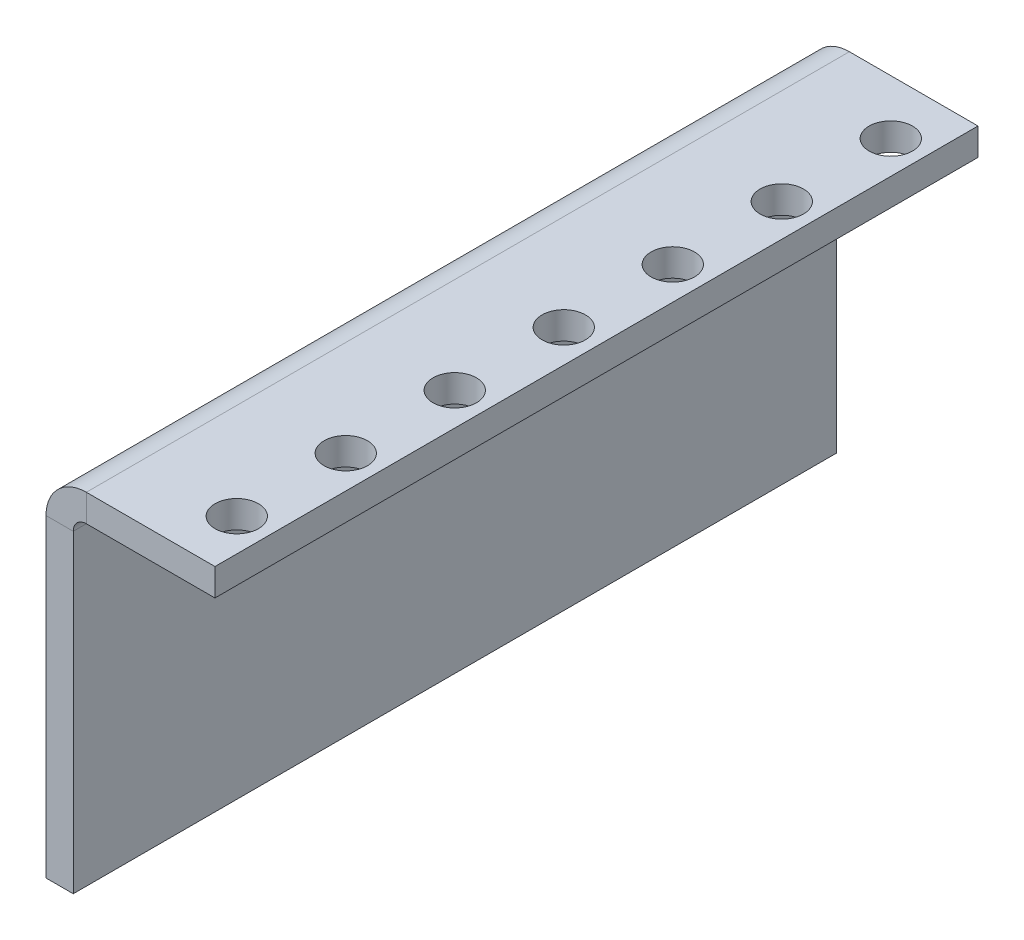
ISO-10303-21;
HEADER;
FILE_DESCRIPTION(('STEP AP214'),'2;1');
FILE_NAME('part.step','',(''),(''),'','','');
FILE_SCHEMA(('AUTOMOTIVE_DESIGN { 1 0 10303 214 1 1 1 1 }'));
ENDSEC;
DATA;
#1=APPLICATION_CONTEXT('core data for automotive mechanical design processes');
#2=APPLICATION_PROTOCOL_DEFINITION('international standard','automotive_design',2000,#1);
#3=PRODUCT_CONTEXT('',#1,'mechanical');
#4=PRODUCT('Part','Part','',(#3));
#5=PRODUCT_RELATED_PRODUCT_CATEGORY('part','',(#4));
#6=PRODUCT_DEFINITION_FORMATION('','',#4);
#7=PRODUCT_DEFINITION_CONTEXT('part definition',#1,'design');
#8=PRODUCT_DEFINITION('design','',#6,#7);
#9=PRODUCT_DEFINITION_SHAPE('','',#8);
#10=(LENGTH_UNIT() NAMED_UNIT(*) SI_UNIT(.MILLI.,.METRE.));
#11=(NAMED_UNIT(*) PLANE_ANGLE_UNIT() SI_UNIT($,.RADIAN.));
#12=(NAMED_UNIT(*) SI_UNIT($,.STERADIAN.) SOLID_ANGLE_UNIT());
#13=UNCERTAINTY_MEASURE_WITH_UNIT(LENGTH_MEASURE(1.E-05),#10,'distance_accuracy_value','');
#14=(GEOMETRIC_REPRESENTATION_CONTEXT(3) GLOBAL_UNCERTAINTY_ASSIGNED_CONTEXT((#13)) GLOBAL_UNIT_ASSIGNED_CONTEXT((#10,
#11,#12)) REPRESENTATION_CONTEXT('',''));
#15=CARTESIAN_POINT('',(0.,0.,0.));
#16=DIRECTION('',(0.,0.,1.));
#17=DIRECTION('',(1.,0.,0.));
#18=AXIS2_PLACEMENT_3D('',#15,#16,#17);
#19=CARTESIAN_POINT('',(0.,36.576,88.9));
#20=DIRECTION('',(0.,0.,1.));
#21=DIRECTION('',(1.,0.,0.));
#22=AXIS2_PLACEMENT_3D('',#19,#20,#21);
#23=PLANE('',#22);
#24=DIRECTION('',(-1.,0.,0.));
#25=VECTOR('',#24,1.);
#26=CARTESIAN_POINT('',(0.,36.576,88.9));
#27=LINE('',#26,#25);
#28=CARTESIAN_POINT('',(0.,36.576,88.9));
#29=VERTEX_POINT('',#28);
#30=CARTESIAN_POINT('',(-3.175,36.5759999999999,88.9));
#31=VERTEX_POINT('',#30);
#32=EDGE_CURVE('E11',#29,#31,#27,.T.);
#33=ORIENTED_EDGE('',*,*,#32,.F.);
#34=CARTESIAN_POINT('',(1.524,36.576,88.9));
#35=DIRECTION('',(0.,0.,1.));
#36=DIRECTION('',(1.,0.,0.));
#37=AXIS2_PLACEMENT_3D('',#34,#35,#36);
#38=CIRCLE('',#37,1.524);
#39=CARTESIAN_POINT('',(1.524,38.1,88.9));
#40=VERTEX_POINT('',#39);
#41=EDGE_CURVE('E132',#29,#40,#38,.F.);
#42=ORIENTED_EDGE('',*,*,#41,.T.);
#43=DIRECTION('',(0.,-1.,0.));
#44=VECTOR('',#43,1.);
#45=CARTESIAN_POINT('',(1.524,41.275,88.9));
#46=LINE('',#45,#44);
#47=CARTESIAN_POINT('',(1.524,41.275,88.9));
#48=VERTEX_POINT('',#47);
#49=EDGE_CURVE('E50',#48,#40,#46,.T.);
#50=ORIENTED_EDGE('',*,*,#49,.F.);
#51=CARTESIAN_POINT('',(1.524,36.576,88.9));
#52=DIRECTION('',(0.,0.,1.));
#53=DIRECTION('',(1.,0.,0.));
#54=AXIS2_PLACEMENT_3D('',#51,#52,#53);
#55=CIRCLE('',#54,4.699);
#56=EDGE_CURVE('E139',#31,#48,#55,.F.);
#57=ORIENTED_EDGE('',*,*,#56,.F.);
#58=EDGE_LOOP('',(#33,#42,#50,#57));
#59=FACE_BOUND('',#58,.T.);
#60=ADVANCED_FACE('F42',(#59),#23,.T.);
#61=CARTESIAN_POINT('',(1.524,41.275,88.9));
#62=DIRECTION('',(0.,0.,1.));
#63=DIRECTION('',(1.,0.,0.));
#64=AXIS2_PLACEMENT_3D('',#61,#62,#63);
#65=PLANE('',#64);
#66=DIRECTION('',(0.,1.,0.));
#67=VECTOR('',#66,1.);
#68=CARTESIAN_POINT('',(0.,0.,88.9));
#69=LINE('',#68,#67);
#70=CARTESIAN_POINT('',(0.,0.,88.9));
#71=VERTEX_POINT('',#70);
#72=EDGE_CURVE('E127',#71,#29,#69,.T.);
#73=ORIENTED_EDGE('',*,*,#72,.T.);
#74=ORIENTED_EDGE('',*,*,#32,.T.);
#75=DIRECTION('',(0.,1.,0.));
#76=VECTOR('',#75,1.);
#77=CARTESIAN_POINT('',(-3.175,0.,88.9));
#78=LINE('',#77,#76);
#79=CARTESIAN_POINT('',(-3.175,0.,88.9));
#80=VERTEX_POINT('',#79);
#81=EDGE_CURVE('E137',#80,#31,#78,.T.);
#82=ORIENTED_EDGE('',*,*,#81,.F.);
#83=DIRECTION('',(-1.,0.,0.));
#84=VECTOR('',#83,1.);
#85=CARTESIAN_POINT('',(0.,0.,88.9));
#86=LINE('',#85,#84);
#87=EDGE_CURVE('E118',#71,#80,#86,.T.);
#88=ORIENTED_EDGE('',*,*,#87,.F.);
#89=EDGE_LOOP('',(#73,#74,#82,#88));
#90=FACE_BOUND('',#89,.T.);
#91=ADVANCED_FACE('F135',(#90),#65,.T.);
#92=CARTESIAN_POINT('',(1.524,38.1,0.));
#93=DIRECTION('',(0.,0.,-1.));
#94=DIRECTION('',(-1.,0.,0.));
#95=AXIS2_PLACEMENT_3D('',#92,#93,#94);
#96=PLANE('',#95);
#97=DIRECTION('',(0.,1.,0.));
#98=VECTOR('',#97,1.);
#99=CARTESIAN_POINT('',(1.524,38.1,0.));
#100=LINE('',#99,#98);
#101=CARTESIAN_POINT('',(1.524,38.1,0.));
#102=VERTEX_POINT('',#101);
#103=CARTESIAN_POINT('',(1.524,41.275,0.));
#104=VERTEX_POINT('',#103);
#105=EDGE_CURVE('E93',#102,#104,#100,.T.);
#106=ORIENTED_EDGE('',*,*,#105,.F.);
#107=CARTESIAN_POINT('',(1.524,36.576,0.));
#108=DIRECTION('',(0.,0.,1.));
#109=DIRECTION('',(1.,0.,0.));
#110=AXIS2_PLACEMENT_3D('',#107,#108,#109);
#111=CIRCLE('',#110,1.524);
#112=CARTESIAN_POINT('',(0.,36.576,0.));
#113=VERTEX_POINT('',#112);
#114=EDGE_CURVE('E162',#113,#102,#111,.F.);
#115=ORIENTED_EDGE('',*,*,#114,.F.);
#116=DIRECTION('',(1.,0.,0.));
#117=VECTOR('',#116,1.);
#118=CARTESIAN_POINT('',(-3.175,36.5759999999999,0.));
#119=LINE('',#118,#117);
#120=CARTESIAN_POINT('',(-3.175,36.5759999999999,0.));
#121=VERTEX_POINT('',#120);
#122=EDGE_CURVE('E86',#121,#113,#119,.T.);
#123=ORIENTED_EDGE('',*,*,#122,.F.);
#124=CARTESIAN_POINT('',(1.524,36.576,0.));
#125=DIRECTION('',(0.,0.,1.));
#126=DIRECTION('',(1.,0.,0.));
#127=AXIS2_PLACEMENT_3D('',#124,#125,#126);
#128=CIRCLE('',#127,4.699);
#129=EDGE_CURVE('E155',#121,#104,#128,.F.);
#130=ORIENTED_EDGE('',*,*,#129,.T.);
#131=EDGE_LOOP('',(#106,#115,#123,#130));
#132=FACE_BOUND('',#131,.T.);
#133=ADVANCED_FACE('F194',(#132),#96,.T.);
#134=CARTESIAN_POINT('',(-3.175,36.5759999999999,0.));
#135=DIRECTION('',(0.,0.,-1.));
#136=DIRECTION('',(-1.,0.,0.));
#137=AXIS2_PLACEMENT_3D('',#134,#135,#136);
#138=PLANE('',#137);
#139=DIRECTION('',(1.,0.,0.));
#140=VECTOR('',#139,1.);
#141=CARTESIAN_POINT('',(0.,38.1,0.));
#142=LINE('',#141,#140);
#143=CARTESIAN_POINT('',(16.51,38.1,0.));
#144=VERTEX_POINT('',#143);
#145=EDGE_CURVE('E145',#102,#144,#142,.T.);
#146=ORIENTED_EDGE('',*,*,#145,.F.);
#147=ORIENTED_EDGE('',*,*,#105,.T.);
#148=DIRECTION('',(1.,0.,0.));
#149=VECTOR('',#148,1.);
#150=CARTESIAN_POINT('',(0.,41.275,0.));
#151=LINE('',#150,#149);
#152=CARTESIAN_POINT('',(16.51,41.275,0.));
#153=VERTEX_POINT('',#152);
#154=EDGE_CURVE('E152',#104,#153,#151,.T.);
#155=ORIENTED_EDGE('',*,*,#154,.T.);
#156=DIRECTION('',(0.,-1.,0.));
#157=VECTOR('',#156,1.);
#158=CARTESIAN_POINT('',(16.51,41.275,0.));
#159=LINE('',#158,#157);
#160=EDGE_CURVE('E148',#153,#144,#159,.T.);
#161=ORIENTED_EDGE('',*,*,#160,.T.);
#162=EDGE_LOOP('',(#146,#147,#155,#161));
#163=FACE_BOUND('',#162,.T.);
#164=ADVANCED_FACE('F181',(#163),#138,.T.);
#165=CARTESIAN_POINT('',(0.,38.1,88.9));
#166=DIRECTION('',(0.,1.,0.));
#167=DIRECTION('',(0.,0.,1.));
#168=AXIS2_PLACEMENT_3D('',#165,#166,#167);
#169=PLANE('',#168);
#170=CARTESIAN_POINT('',(12.7,38.1,6.35));
#171=DIRECTION('',(0.,1.,0.));
#172=DIRECTION('',(0.,0.,1.));
#173=AXIS2_PLACEMENT_3D('',#170,#171,#172);
#174=CIRCLE('',#173,2.5273);
#175=CARTESIAN_POINT('',(12.7,38.1,8.8773));
#176=VERTEX_POINT('',#175);
#177=EDGE_CURVE('E241',#176,#176,#174,.T.);
#178=ORIENTED_EDGE('',*,*,#177,.T.);
#179=EDGE_LOOP('',(#178));
#180=FACE_BOUND('',#179,.T.);
#181=CARTESIAN_POINT('',(12.7,38.1,19.05));
#182=DIRECTION('',(0.,1.,0.));
#183=DIRECTION('',(0.,0.,1.));
#184=AXIS2_PLACEMENT_3D('',#181,#182,#183);
#185=CIRCLE('',#184,2.5273);
#186=CARTESIAN_POINT('',(12.7,38.1,21.5773));
#187=VERTEX_POINT('',#186);
#188=EDGE_CURVE('E235',#187,#187,#185,.T.);
#189=ORIENTED_EDGE('',*,*,#188,.T.);
#190=EDGE_LOOP('',(#189));
#191=FACE_BOUND('',#190,.T.);
#192=CARTESIAN_POINT('',(12.7,38.1,31.75));
#193=DIRECTION('',(0.,1.,0.));
#194=DIRECTION('',(0.,0.,1.));
#195=AXIS2_PLACEMENT_3D('',#192,#193,#194);
#196=CIRCLE('',#195,2.5273);
#197=CARTESIAN_POINT('',(12.7,38.1,34.2773));
#198=VERTEX_POINT('',#197);
#199=EDGE_CURVE('E229',#198,#198,#196,.T.);
#200=ORIENTED_EDGE('',*,*,#199,.T.);
#201=EDGE_LOOP('',(#200));
#202=FACE_BOUND('',#201,.T.);
#203=CARTESIAN_POINT('',(12.7,38.1,44.45));
#204=DIRECTION('',(0.,1.,0.));
#205=DIRECTION('',(0.,0.,1.));
#206=AXIS2_PLACEMENT_3D('',#203,#204,#205);
#207=CIRCLE('',#206,2.5273);
#208=CARTESIAN_POINT('',(12.7,38.1,46.9773));
#209=VERTEX_POINT('',#208);
#210=EDGE_CURVE('E223',#209,#209,#207,.T.);
#211=ORIENTED_EDGE('',*,*,#210,.T.);
#212=EDGE_LOOP('',(#211));
#213=FACE_BOUND('',#212,.T.);
#214=CARTESIAN_POINT('',(12.7,38.1,57.15));
#215=DIRECTION('',(0.,1.,0.));
#216=DIRECTION('',(0.,0.,1.));
#217=AXIS2_PLACEMENT_3D('',#214,#215,#216);
#218=CIRCLE('',#217,2.5273);
#219=CARTESIAN_POINT('',(12.7,38.1,59.6773));
#220=VERTEX_POINT('',#219);
#221=EDGE_CURVE('E217',#220,#220,#218,.T.);
#222=ORIENTED_EDGE('',*,*,#221,.T.);
#223=EDGE_LOOP('',(#222));
#224=FACE_BOUND('',#223,.T.);
#225=CARTESIAN_POINT('',(12.7,38.1,69.85));
#226=DIRECTION('',(0.,1.,0.));
#227=DIRECTION('',(0.,0.,1.));
#228=AXIS2_PLACEMENT_3D('',#225,#226,#227);
#229=CIRCLE('',#228,2.5273);
#230=CARTESIAN_POINT('',(12.7,38.1,72.3773));
#231=VERTEX_POINT('',#230);
#232=EDGE_CURVE('E211',#231,#231,#229,.T.);
#233=ORIENTED_EDGE('',*,*,#232,.T.);
#234=EDGE_LOOP('',(#233));
#235=FACE_BOUND('',#234,.T.);
#236=CARTESIAN_POINT('',(12.7,38.1,82.55));
#237=DIRECTION('',(0.,1.,0.));
#238=DIRECTION('',(0.,0.,1.));
#239=AXIS2_PLACEMENT_3D('',#236,#237,#238);
#240=CIRCLE('',#239,2.5273);
#241=CARTESIAN_POINT('',(12.7,38.1,85.0773));
#242=VERTEX_POINT('',#241);
#243=EDGE_CURVE('E149',#242,#242,#240,.T.);
#244=ORIENTED_EDGE('',*,*,#243,.T.);
#245=EDGE_LOOP('',(#244));
#246=FACE_BOUND('',#245,.T.);
#247=ORIENTED_EDGE('',*,*,#145,.T.);
#248=DIRECTION('',(0.,0.,-1.));
#249=VECTOR('',#248,1.);
#250=CARTESIAN_POINT('',(16.51,38.1,88.9));
#251=LINE('',#250,#249);
#252=CARTESIAN_POINT('',(16.51,38.1,88.9));
#253=VERTEX_POINT('',#252);
#254=EDGE_CURVE('E176',#253,#144,#251,.T.);
#255=ORIENTED_EDGE('',*,*,#254,.F.);
#256=DIRECTION('',(1.,0.,0.));
#257=VECTOR('',#256,1.);
#258=CARTESIAN_POINT('',(0.,38.1,88.9));
#259=LINE('',#258,#257);
#260=EDGE_CURVE('E99',#40,#253,#259,.T.);
#261=ORIENTED_EDGE('',*,*,#260,.F.);
#262=DIRECTION('',(0.,0.,-1.));
#263=VECTOR('',#262,1.);
#264=CARTESIAN_POINT('',(1.524,38.1,88.9));
#265=LINE('',#264,#263);
#266=EDGE_CURVE('E144',#40,#102,#265,.T.);
#267=ORIENTED_EDGE('',*,*,#266,.T.);
#268=EDGE_LOOP('',(#247,#255,#261,#267));
#269=FACE_BOUND('',#268,.T.);
#270=ADVANCED_FACE('F294',(#180,#191,#202,#213,#224,#235,#246,#269),#169,.F.);
#271=CARTESIAN_POINT('',(16.51,41.275,88.9));
#272=DIRECTION('',(1.,0.,0.));
#273=DIRECTION('',(0.,0.,-1.));
#274=AXIS2_PLACEMENT_3D('',#271,#272,#273);
#275=PLANE('',#274);
#276=ORIENTED_EDGE('',*,*,#160,.F.);
#277=DIRECTION('',(0.,0.,-1.));
#278=VECTOR('',#277,1.);
#279=CARTESIAN_POINT('',(16.51,41.275,88.9));
#280=LINE('',#279,#278);
#281=CARTESIAN_POINT('',(16.51,41.275,88.9));
#282=VERTEX_POINT('',#281);
#283=EDGE_CURVE('E174',#282,#153,#280,.T.);
#284=ORIENTED_EDGE('',*,*,#283,.F.);
#285=DIRECTION('',(0.,-1.,0.));
#286=VECTOR('',#285,1.);
#287=CARTESIAN_POINT('',(16.51,41.275,88.9));
#288=LINE('',#287,#286);
#289=EDGE_CURVE('E200',#282,#253,#288,.T.);
#290=ORIENTED_EDGE('',*,*,#289,.T.);
#291=ORIENTED_EDGE('',*,*,#254,.T.);
#292=EDGE_LOOP('',(#276,#284,#290,#291));
#293=FACE_BOUND('',#292,.T.);
#294=ADVANCED_FACE('F252',(#293),#275,.T.);
#295=CARTESIAN_POINT('',(0.,41.275,88.9));
#296=DIRECTION('',(0.,1.,0.));
#297=DIRECTION('',(0.,0.,1.));
#298=AXIS2_PLACEMENT_3D('',#295,#296,#297);
#299=PLANE('',#298);
#300=CARTESIAN_POINT('',(12.7,41.275,6.35));
#301=DIRECTION('',(0.,1.,0.));
#302=DIRECTION('',(0.,0.,1.));
#303=AXIS2_PLACEMENT_3D('',#300,#301,#302);
#304=CIRCLE('',#303,2.5273);
#305=CARTESIAN_POINT('',(12.7,41.275,8.8773));
#306=VERTEX_POINT('',#305);
#307=EDGE_CURVE('E244',#306,#306,#304,.T.);
#308=ORIENTED_EDGE('',*,*,#307,.F.);
#309=EDGE_LOOP('',(#308));
#310=FACE_BOUND('',#309,.T.);
#311=CARTESIAN_POINT('',(12.7,41.275,19.05));
#312=DIRECTION('',(0.,1.,0.));
#313=DIRECTION('',(0.,0.,1.));
#314=AXIS2_PLACEMENT_3D('',#311,#312,#313);
#315=CIRCLE('',#314,2.5273);
#316=CARTESIAN_POINT('',(12.7,41.275,21.5773));
#317=VERTEX_POINT('',#316);
#318=EDGE_CURVE('E238',#317,#317,#315,.T.);
#319=ORIENTED_EDGE('',*,*,#318,.F.);
#320=EDGE_LOOP('',(#319));
#321=FACE_BOUND('',#320,.T.);
#322=CARTESIAN_POINT('',(12.7,41.275,31.75));
#323=DIRECTION('',(0.,1.,0.));
#324=DIRECTION('',(0.,0.,1.));
#325=AXIS2_PLACEMENT_3D('',#322,#323,#324);
#326=CIRCLE('',#325,2.5273);
#327=CARTESIAN_POINT('',(12.7,41.275,34.2773));
#328=VERTEX_POINT('',#327);
#329=EDGE_CURVE('E232',#328,#328,#326,.T.);
#330=ORIENTED_EDGE('',*,*,#329,.F.);
#331=EDGE_LOOP('',(#330));
#332=FACE_BOUND('',#331,.T.);
#333=CARTESIAN_POINT('',(12.7,41.275,44.45));
#334=DIRECTION('',(0.,1.,0.));
#335=DIRECTION('',(0.,0.,1.));
#336=AXIS2_PLACEMENT_3D('',#333,#334,#335);
#337=CIRCLE('',#336,2.5273);
#338=CARTESIAN_POINT('',(12.7,41.275,46.9773));
#339=VERTEX_POINT('',#338);
#340=EDGE_CURVE('E226',#339,#339,#337,.T.);
#341=ORIENTED_EDGE('',*,*,#340,.F.);
#342=EDGE_LOOP('',(#341));
#343=FACE_BOUND('',#342,.T.);
#344=CARTESIAN_POINT('',(12.7,41.275,57.15));
#345=DIRECTION('',(0.,1.,0.));
#346=DIRECTION('',(0.,0.,1.));
#347=AXIS2_PLACEMENT_3D('',#344,#345,#346);
#348=CIRCLE('',#347,2.5273);
#349=CARTESIAN_POINT('',(12.7,41.275,59.6773));
#350=VERTEX_POINT('',#349);
#351=EDGE_CURVE('E220',#350,#350,#348,.T.);
#352=ORIENTED_EDGE('',*,*,#351,.F.);
#353=EDGE_LOOP('',(#352));
#354=FACE_BOUND('',#353,.T.);
#355=CARTESIAN_POINT('',(12.7,41.275,69.85));
#356=DIRECTION('',(0.,1.,0.));
#357=DIRECTION('',(0.,0.,1.));
#358=AXIS2_PLACEMENT_3D('',#355,#356,#357);
#359=CIRCLE('',#358,2.5273);
#360=CARTESIAN_POINT('',(12.7,41.275,72.3773));
#361=VERTEX_POINT('',#360);
#362=EDGE_CURVE('E214',#361,#361,#359,.T.);
#363=ORIENTED_EDGE('',*,*,#362,.F.);
#364=EDGE_LOOP('',(#363));
#365=FACE_BOUND('',#364,.T.);
#366=CARTESIAN_POINT('',(12.7,41.275,82.55));
#367=DIRECTION('',(0.,1.,0.));
#368=DIRECTION('',(0.,0.,1.));
#369=AXIS2_PLACEMENT_3D('',#366,#367,#368);
#370=CIRCLE('',#369,2.5273);
#371=CARTESIAN_POINT('',(12.7,41.275,85.0773));
#372=VERTEX_POINT('',#371);
#373=EDGE_CURVE('E208',#372,#372,#370,.T.);
#374=ORIENTED_EDGE('',*,*,#373,.F.);
#375=EDGE_LOOP('',(#374));
#376=FACE_BOUND('',#375,.T.);
#377=ORIENTED_EDGE('',*,*,#154,.F.);
#378=DIRECTION('',(0.,0.,-1.));
#379=VECTOR('',#378,1.);
#380=CARTESIAN_POINT('',(1.524,41.275,88.9));
#381=LINE('',#380,#379);
#382=EDGE_CURVE('E171',#48,#104,#381,.T.);
#383=ORIENTED_EDGE('',*,*,#382,.F.);
#384=DIRECTION('',(1.,0.,0.));
#385=VECTOR('',#384,1.);
#386=CARTESIAN_POINT('',(0.,41.275,88.9));
#387=LINE('',#386,#385);
#388=EDGE_CURVE('E199',#48,#282,#387,.T.);
#389=ORIENTED_EDGE('',*,*,#388,.T.);
#390=ORIENTED_EDGE('',*,*,#283,.T.);
#391=EDGE_LOOP('',(#377,#383,#389,#390));
#392=FACE_BOUND('',#391,.T.);
#393=ADVANCED_FACE('F192',(#310,#321,#332,#343,#354,#365,#376,#392),#299,.T.);
#394=CARTESIAN_POINT('',(1.524,36.576,88.9));
#395=DIRECTION('',(0.,0.,-1.));
#396=DIRECTION('',(-1.,0.,0.));
#397=AXIS2_PLACEMENT_3D('',#394,#395,#396);
#398=CYLINDRICAL_SURFACE('',#397,4.699);
#399=ORIENTED_EDGE('',*,*,#129,.F.);
#400=DIRECTION('',(0.,0.,-1.));
#401=VECTOR('',#400,1.);
#402=CARTESIAN_POINT('',(-3.175,36.5759999999999,88.9));
#403=LINE('',#402,#401);
#404=EDGE_CURVE('E168',#31,#121,#403,.T.);
#405=ORIENTED_EDGE('',*,*,#404,.F.);
#406=ORIENTED_EDGE('',*,*,#56,.T.);
#407=ORIENTED_EDGE('',*,*,#382,.T.);
#408=EDGE_LOOP('',(#399,#405,#406,#407));
#409=FACE_BOUND('',#408,.T.);
#410=ADVANCED_FACE('F187',(#409),#398,.T.);
#411=CARTESIAN_POINT('',(-3.175,0.,88.9));
#412=DIRECTION('',(-1.,0.,0.));
#413=DIRECTION('',(0.,0.,1.));
#414=AXIS2_PLACEMENT_3D('',#411,#412,#413);
#415=PLANE('',#414);
#416=DIRECTION('',(0.,1.,0.));
#417=VECTOR('',#416,1.);
#418=CARTESIAN_POINT('',(-3.175,0.,0.));
#419=LINE('',#418,#417);
#420=CARTESIAN_POINT('',(-3.175,0.,0.));
#421=VERTEX_POINT('',#420);
#422=EDGE_CURVE('E157',#421,#121,#419,.T.);
#423=ORIENTED_EDGE('',*,*,#422,.F.);
#424=DIRECTION('',(0.,0.,-1.));
#425=VECTOR('',#424,1.);
#426=CARTESIAN_POINT('',(-3.175,0.,88.9));
#427=LINE('',#426,#425);
#428=EDGE_CURVE('E122',#80,#421,#427,.T.);
#429=ORIENTED_EDGE('',*,*,#428,.F.);
#430=ORIENTED_EDGE('',*,*,#81,.T.);
#431=ORIENTED_EDGE('',*,*,#404,.T.);
#432=EDGE_LOOP('',(#423,#429,#430,#431));
#433=FACE_BOUND('',#432,.T.);
#434=ADVANCED_FACE('F197',(#433),#415,.T.);
#435=CARTESIAN_POINT('',(0.,0.,88.9));
#436=DIRECTION('',(0.,-1.,0.));
#437=DIRECTION('',(0.,0.,-1.));
#438=AXIS2_PLACEMENT_3D('',#435,#436,#437);
#439=PLANE('',#438);
#440=DIRECTION('',(-1.,0.,0.));
#441=VECTOR('',#440,1.);
#442=CARTESIAN_POINT('',(0.,0.,0.));
#443=LINE('',#442,#441);
#444=CARTESIAN_POINT('',(0.,0.,0.));
#445=VERTEX_POINT('',#444);
#446=EDGE_CURVE('E120',#445,#421,#443,.T.);
#447=ORIENTED_EDGE('',*,*,#446,.F.);
#448=DIRECTION('',(0.,0.,-1.));
#449=VECTOR('',#448,1.);
#450=CARTESIAN_POINT('',(0.,0.,88.9));
#451=LINE('',#450,#449);
#452=EDGE_CURVE('E114',#71,#445,#451,.T.);
#453=ORIENTED_EDGE('',*,*,#452,.F.);
#454=ORIENTED_EDGE('',*,*,#87,.T.);
#455=ORIENTED_EDGE('',*,*,#428,.T.);
#456=EDGE_LOOP('',(#447,#453,#454,#455));
#457=FACE_BOUND('',#456,.T.);
#458=ADVANCED_FACE('F116',(#457),#439,.T.);
#459=CARTESIAN_POINT('',(0.,0.,88.9));
#460=DIRECTION('',(-1.,0.,0.));
#461=DIRECTION('',(0.,0.,1.));
#462=AXIS2_PLACEMENT_3D('',#459,#460,#461);
#463=PLANE('',#462);
#464=DIRECTION('',(0.,1.,0.));
#465=VECTOR('',#464,1.);
#466=CARTESIAN_POINT('',(0.,0.,0.));
#467=LINE('',#466,#465);
#468=EDGE_CURVE('E160',#445,#113,#467,.T.);
#469=ORIENTED_EDGE('',*,*,#468,.T.);
#470=DIRECTION('',(0.,0.,-1.));
#471=VECTOR('',#470,1.);
#472=CARTESIAN_POINT('',(0.,36.576,88.9));
#473=LINE('',#472,#471);
#474=EDGE_CURVE('E123',#29,#113,#473,.T.);
#475=ORIENTED_EDGE('',*,*,#474,.F.);
#476=ORIENTED_EDGE('',*,*,#72,.F.);
#477=ORIENTED_EDGE('',*,*,#452,.T.);
#478=EDGE_LOOP('',(#469,#475,#476,#477));
#479=FACE_BOUND('',#478,.T.);
#480=ADVANCED_FACE('F128',(#479),#463,.F.);
#481=CARTESIAN_POINT('',(1.524,36.576,88.9));
#482=DIRECTION('',(0.,0.,-1.));
#483=DIRECTION('',(-1.,0.,0.));
#484=AXIS2_PLACEMENT_3D('',#481,#482,#483);
#485=CYLINDRICAL_SURFACE('',#484,1.524);
#486=ORIENTED_EDGE('',*,*,#114,.T.);
#487=ORIENTED_EDGE('',*,*,#266,.F.);
#488=ORIENTED_EDGE('',*,*,#41,.F.);
#489=ORIENTED_EDGE('',*,*,#474,.T.);
#490=EDGE_LOOP('',(#486,#487,#488,#489));
#491=FACE_BOUND('',#490,.T.);
#492=ADVANCED_FACE('F309',(#491),#485,.F.);
#493=CARTESIAN_POINT('',(1.524,36.576,88.9));
#494=DIRECTION('',(0.,0.,1.));
#495=DIRECTION('',(1.,0.,0.));
#496=AXIS2_PLACEMENT_3D('',#493,#494,#495);
#497=PLANE('',#496);
#498=ORIENTED_EDGE('',*,*,#260,.T.);
#499=ORIENTED_EDGE('',*,*,#289,.F.);
#500=ORIENTED_EDGE('',*,*,#388,.F.);
#501=ORIENTED_EDGE('',*,*,#49,.T.);
#502=EDGE_LOOP('',(#498,#499,#500,#501));
#503=FACE_BOUND('',#502,.T.);
#504=ADVANCED_FACE('F279',(#503),#497,.T.);
#505=CARTESIAN_POINT('',(1.524,36.576,0.));
#506=DIRECTION('',(0.,0.,1.));
#507=DIRECTION('',(1.,0.,0.));
#508=AXIS2_PLACEMENT_3D('',#505,#506,#507);
#509=PLANE('',#508);
#510=ORIENTED_EDGE('',*,*,#422,.T.);
#511=ORIENTED_EDGE('',*,*,#122,.T.);
#512=ORIENTED_EDGE('',*,*,#468,.F.);
#513=ORIENTED_EDGE('',*,*,#446,.T.);
#514=EDGE_LOOP('',(#510,#511,#512,#513));
#515=FACE_BOUND('',#514,.T.);
#516=ADVANCED_FACE('F269',(#515),#509,.F.);
#517=CARTESIAN_POINT('',(12.7,41.275,82.55));
#518=DIRECTION('',(0.,1.,0.));
#519=DIRECTION('',(0.,0.,1.));
#520=AXIS2_PLACEMENT_3D('',#517,#518,#519);
#521=CYLINDRICAL_SURFACE('',#520,2.5273);
#522=ORIENTED_EDGE('',*,*,#243,.F.);
#523=EDGE_LOOP('',(#522));
#524=FACE_BOUND('',#523,.T.);
#525=ORIENTED_EDGE('',*,*,#373,.T.);
#526=EDGE_LOOP('',(#525));
#527=FACE_BOUND('',#526,.T.);
#528=ADVANCED_FACE('F266',(#524,#527),#521,.F.);
#529=CARTESIAN_POINT('',(12.7,41.275,69.85));
#530=DIRECTION('',(0.,1.,0.));
#531=DIRECTION('',(0.,0.,1.));
#532=AXIS2_PLACEMENT_3D('',#529,#530,#531);
#533=CYLINDRICAL_SURFACE('',#532,2.5273);
#534=ORIENTED_EDGE('',*,*,#232,.F.);
#535=EDGE_LOOP('',(#534));
#536=FACE_BOUND('',#535,.T.);
#537=ORIENTED_EDGE('',*,*,#362,.T.);
#538=EDGE_LOOP('',(#537));
#539=FACE_BOUND('',#538,.T.);
#540=ADVANCED_FACE('F268',(#536,#539),#533,.F.);
#541=CARTESIAN_POINT('',(12.7,41.275,57.15));
#542=DIRECTION('',(0.,1.,0.));
#543=DIRECTION('',(0.,0.,1.));
#544=AXIS2_PLACEMENT_3D('',#541,#542,#543);
#545=CYLINDRICAL_SURFACE('',#544,2.5273);
#546=ORIENTED_EDGE('',*,*,#221,.F.);
#547=EDGE_LOOP('',(#546));
#548=FACE_BOUND('',#547,.T.);
#549=ORIENTED_EDGE('',*,*,#351,.T.);
#550=EDGE_LOOP('',(#549));
#551=FACE_BOUND('',#550,.T.);
#552=ADVANCED_FACE('F276',(#548,#551),#545,.F.);
#553=CARTESIAN_POINT('',(12.7,41.275,44.45));
#554=DIRECTION('',(0.,1.,0.));
#555=DIRECTION('',(0.,0.,1.));
#556=AXIS2_PLACEMENT_3D('',#553,#554,#555);
#557=CYLINDRICAL_SURFACE('',#556,2.5273);
#558=ORIENTED_EDGE('',*,*,#210,.F.);
#559=EDGE_LOOP('',(#558));
#560=FACE_BOUND('',#559,.T.);
#561=ORIENTED_EDGE('',*,*,#340,.T.);
#562=EDGE_LOOP('',(#561));
#563=FACE_BOUND('',#562,.T.);
#564=ADVANCED_FACE('F360',(#560,#563),#557,.F.);
#565=CARTESIAN_POINT('',(12.7,41.275,31.75));
#566=DIRECTION('',(0.,1.,0.));
#567=DIRECTION('',(0.,0.,1.));
#568=AXIS2_PLACEMENT_3D('',#565,#566,#567);
#569=CYLINDRICAL_SURFACE('',#568,2.5273);
#570=ORIENTED_EDGE('',*,*,#199,.F.);
#571=EDGE_LOOP('',(#570));
#572=FACE_BOUND('',#571,.T.);
#573=ORIENTED_EDGE('',*,*,#329,.T.);
#574=EDGE_LOOP('',(#573));
#575=FACE_BOUND('',#574,.T.);
#576=ADVANCED_FACE('F371',(#572,#575),#569,.F.);
#577=CARTESIAN_POINT('',(12.7,41.275,19.05));
#578=DIRECTION('',(0.,1.,0.));
#579=DIRECTION('',(0.,0.,1.));
#580=AXIS2_PLACEMENT_3D('',#577,#578,#579);
#581=CYLINDRICAL_SURFACE('',#580,2.5273);
#582=ORIENTED_EDGE('',*,*,#188,.F.);
#583=EDGE_LOOP('',(#582));
#584=FACE_BOUND('',#583,.T.);
#585=ORIENTED_EDGE('',*,*,#318,.T.);
#586=EDGE_LOOP('',(#585));
#587=FACE_BOUND('',#586,.T.);
#588=ADVANCED_FACE('F382',(#584,#587),#581,.F.);
#589=CARTESIAN_POINT('',(12.7,41.275,6.35));
#590=DIRECTION('',(0.,1.,0.));
#591=DIRECTION('',(0.,0.,1.));
#592=AXIS2_PLACEMENT_3D('',#589,#590,#591);
#593=CYLINDRICAL_SURFACE('',#592,2.5273);
#594=ORIENTED_EDGE('',*,*,#177,.F.);
#595=EDGE_LOOP('',(#594));
#596=FACE_BOUND('',#595,.T.);
#597=ORIENTED_EDGE('',*,*,#307,.T.);
#598=EDGE_LOOP('',(#597));
#599=FACE_BOUND('',#598,.T.);
#600=ADVANCED_FACE('F248',(#596,#599),#593,.F.);
#601=CLOSED_SHELL('',(#60,#91,#133,#164,#270,#294,#393,#410,#434,#458,#480,#492,#504,#516,#528,
#540,#552,#564,#576,#588,#600));
#602=MANIFOLD_SOLID_BREP('B2',#601);
#603=ADVANCED_BREP_SHAPE_REPRESENTATION('',(#18,#602),#14);
#604=SHAPE_DEFINITION_REPRESENTATION(#9,#603);
ENDSEC;
END-ISO-10303-21;
